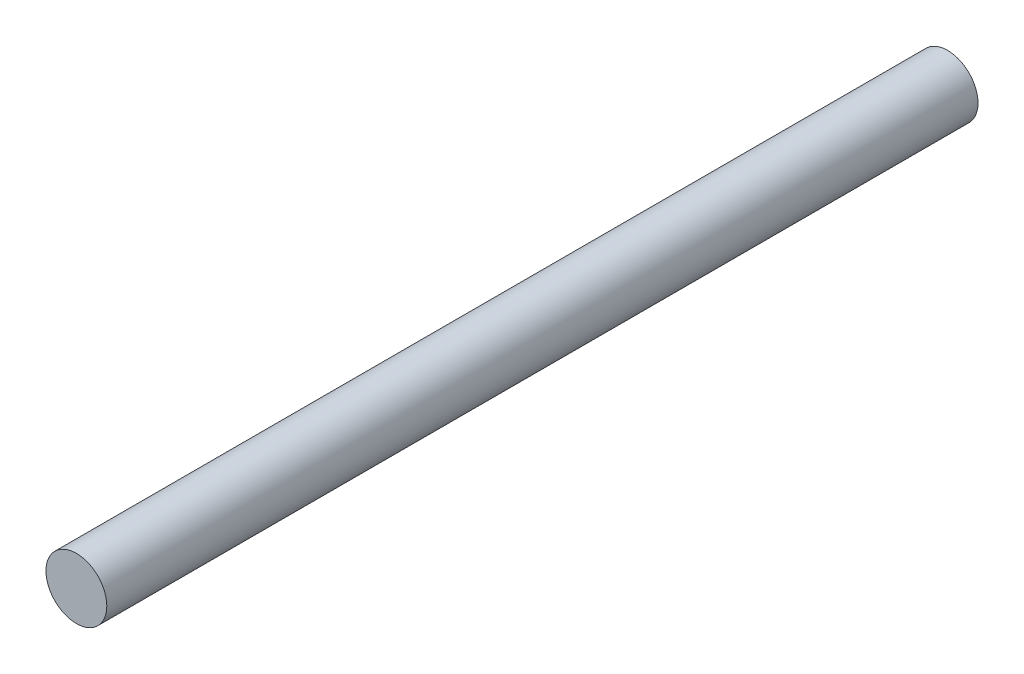
ISO-10303-21;
HEADER;
FILE_DESCRIPTION(('STEP AP214'),'2;1');
FILE_NAME('part.step','',(''),(''),'','','');
FILE_SCHEMA(('AUTOMOTIVE_DESIGN { 1 0 10303 214 1 1 1 1 }'));
ENDSEC;
DATA;
#1=APPLICATION_CONTEXT('core data for automotive mechanical design processes');
#2=APPLICATION_PROTOCOL_DEFINITION('international standard','automotive_design',2000,#1);
#3=PRODUCT_CONTEXT('',#1,'mechanical');
#4=PRODUCT('Part','Part','',(#3));
#5=PRODUCT_RELATED_PRODUCT_CATEGORY('part','',(#4));
#6=PRODUCT_DEFINITION_FORMATION('','',#4);
#7=PRODUCT_DEFINITION_CONTEXT('part definition',#1,'design');
#8=PRODUCT_DEFINITION('design','',#6,#7);
#9=PRODUCT_DEFINITION_SHAPE('','',#8);
#10=(LENGTH_UNIT() NAMED_UNIT(*) SI_UNIT(.MILLI.,.METRE.));
#11=(NAMED_UNIT(*) PLANE_ANGLE_UNIT() SI_UNIT($,.RADIAN.));
#12=(NAMED_UNIT(*) SI_UNIT($,.STERADIAN.) SOLID_ANGLE_UNIT());
#13=UNCERTAINTY_MEASURE_WITH_UNIT(LENGTH_MEASURE(1.E-05),#10,'distance_accuracy_value','');
#14=(GEOMETRIC_REPRESENTATION_CONTEXT(3) GLOBAL_UNCERTAINTY_ASSIGNED_CONTEXT((#13)) GLOBAL_UNIT_ASSIGNED_CONTEXT((#10,
#11,#12)) REPRESENTATION_CONTEXT('',''));
#15=CARTESIAN_POINT('',(0.,0.,0.));
#16=DIRECTION('',(0.,0.,1.));
#17=DIRECTION('',(1.,0.,0.));
#18=AXIS2_PLACEMENT_3D('',#15,#16,#17);
#19=CARTESIAN_POINT('',(0.,0.,50.));
#20=DIRECTION('',(0.,0.,-1.));
#21=DIRECTION('',(-1.,0.,0.));
#22=AXIS2_PLACEMENT_3D('',#19,#20,#21);
#23=CYLINDRICAL_SURFACE('',#22,1.74625);
#24=CARTESIAN_POINT('',(0.,0.,50.));
#25=DIRECTION('',(0.,0.,1.));
#26=DIRECTION('',(1.,0.,0.));
#27=AXIS2_PLACEMENT_3D('',#24,#25,#26);
#28=CIRCLE('',#27,1.74625);
#29=CARTESIAN_POINT('',(1.74625,0.,50.));
#30=VERTEX_POINT('',#29);
#31=EDGE_CURVE('E10',#30,#30,#28,.T.);
#32=ORIENTED_EDGE('',*,*,#31,.F.);
#33=EDGE_LOOP('',(#32));
#34=FACE_BOUND('',#33,.T.);
#35=CARTESIAN_POINT('',(0.,0.,0.));
#36=DIRECTION('',(0.,0.,1.));
#37=DIRECTION('',(1.,0.,0.));
#38=AXIS2_PLACEMENT_3D('',#35,#36,#37);
#39=CIRCLE('',#38,1.74625);
#40=CARTESIAN_POINT('',(1.74625,0.,0.));
#41=VERTEX_POINT('',#40);
#42=EDGE_CURVE('E45',#41,#41,#39,.T.);
#43=ORIENTED_EDGE('',*,*,#42,.T.);
#44=EDGE_LOOP('',(#43));
#45=FACE_BOUND('',#44,.T.);
#46=ADVANCED_FACE('F39',(#34,#45),#23,.T.);
#47=CARTESIAN_POINT('',(0.,0.,50.));
#48=DIRECTION('',(0.,0.,1.));
#49=DIRECTION('',(1.,0.,0.));
#50=AXIS2_PLACEMENT_3D('',#47,#48,#49);
#51=PLANE('',#50);
#52=ORIENTED_EDGE('',*,*,#31,.T.);
#53=EDGE_LOOP('',(#52));
#54=FACE_BOUND('',#53,.T.);
#55=ADVANCED_FACE('F57',(#54),#51,.T.);
#56=CARTESIAN_POINT('',(0.,0.,0.));
#57=DIRECTION('',(0.,0.,1.));
#58=DIRECTION('',(1.,0.,0.));
#59=AXIS2_PLACEMENT_3D('',#56,#57,#58);
#60=PLANE('',#59);
#61=ORIENTED_EDGE('',*,*,#42,.F.);
#62=EDGE_LOOP('',(#61));
#63=FACE_BOUND('',#62,.T.);
#64=ADVANCED_FACE('F53',(#63),#60,.F.);
#65=CLOSED_SHELL('',(#46,#55,#64));
#66=MANIFOLD_SOLID_BREP('B2',#65);
#67=ADVANCED_BREP_SHAPE_REPRESENTATION('',(#18,#66),#14);
#68=SHAPE_DEFINITION_REPRESENTATION(#9,#67);
ENDSEC;
END-ISO-10303-21;
